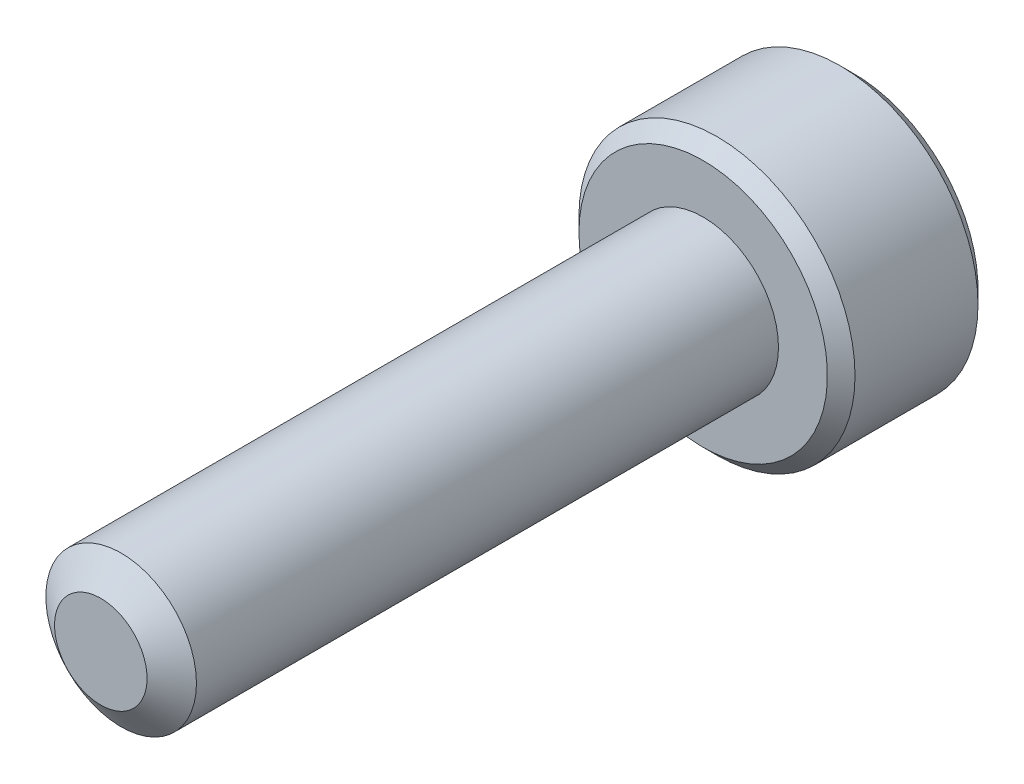
ISO-10303-21;
HEADER;
FILE_DESCRIPTION(('STEP AP214'),'2;1');
FILE_NAME('part.step','',(''),(''),'','','');
FILE_SCHEMA(('AUTOMOTIVE_DESIGN { 1 0 10303 214 1 1 1 1 }'));
ENDSEC;
DATA;
#1=APPLICATION_CONTEXT('core data for automotive mechanical design processes');
#2=APPLICATION_PROTOCOL_DEFINITION('international standard','automotive_design',2000,#1);
#3=PRODUCT_CONTEXT('',#1,'mechanical');
#4=PRODUCT('Part','Part','',(#3));
#5=PRODUCT_RELATED_PRODUCT_CATEGORY('part','',(#4));
#6=PRODUCT_DEFINITION_FORMATION('','',#4);
#7=PRODUCT_DEFINITION_CONTEXT('part definition',#1,'design');
#8=PRODUCT_DEFINITION('design','',#6,#7);
#9=PRODUCT_DEFINITION_SHAPE('','',#8);
#10=(LENGTH_UNIT() NAMED_UNIT(*) SI_UNIT(.MILLI.,.METRE.));
#11=(NAMED_UNIT(*) PLANE_ANGLE_UNIT() SI_UNIT($,.RADIAN.));
#12=(NAMED_UNIT(*) SI_UNIT($,.STERADIAN.) SOLID_ANGLE_UNIT());
#13=UNCERTAINTY_MEASURE_WITH_UNIT(LENGTH_MEASURE(1.E-05),#10,'distance_accuracy_value','');
#14=(GEOMETRIC_REPRESENTATION_CONTEXT(3) GLOBAL_UNCERTAINTY_ASSIGNED_CONTEXT((#13)) GLOBAL_UNIT_ASSIGNED_CONTEXT((#10,
#11,#12)) REPRESENTATION_CONTEXT('',''));
#15=CARTESIAN_POINT('',(0.,0.,0.));
#16=DIRECTION('',(0.,0.,1.));
#17=DIRECTION('',(1.,0.,0.));
#18=AXIS2_PLACEMENT_3D('',#15,#16,#17);
#19=CARTESIAN_POINT('',(0.,0.,-12.));
#20=DIRECTION('',(0.,0.,1.));
#21=DIRECTION('',(1.,0.,0.));
#22=AXIS2_PLACEMENT_3D('',#19,#20,#21);
#23=CYLINDRICAL_SURFACE('',#22,1.5);
#24=CARTESIAN_POINT('',(0.,0.,-12.));
#25=DIRECTION('',(0.,0.,-1.));
#26=DIRECTION('',(-1.,0.,0.));
#27=AXIS2_PLACEMENT_3D('',#24,#25,#26);
#28=CIRCLE('',#27,1.5);
#29=CARTESIAN_POINT('',(-1.5,0.,-12.));
#30=VERTEX_POINT('',#29);
#31=EDGE_CURVE('E154',#30,#30,#28,.F.);
#32=ORIENTED_EDGE('',*,*,#31,.T.);
#33=EDGE_LOOP('',(#32));
#34=FACE_BOUND('',#33,.T.);
#35=CARTESIAN_POINT('',(0.,0.,-0.40525178320938));
#36=DIRECTION('',(0.,0.,1.));
#37=DIRECTION('',(1.,0.,0.));
#38=AXIS2_PLACEMENT_3D('',#35,#36,#37);
#39=CIRCLE('',#38,1.5);
#40=CARTESIAN_POINT('',(1.5,0.,-0.40525178320938));
#41=VERTEX_POINT('',#40);
#42=EDGE_CURVE('E171',#41,#41,#39,.T.);
#43=ORIENTED_EDGE('',*,*,#42,.F.);
#44=EDGE_LOOP('',(#43));
#45=FACE_BOUND('',#44,.T.);
#46=ADVANCED_FACE('F39',(#34,#45),#23,.T.);
#47=CARTESIAN_POINT('',(0.,0.,0.));
#48=DIRECTION('',(0.,0.,-1.));
#49=DIRECTION('',(-1.,0.,0.));
#50=AXIS2_PLACEMENT_3D('',#47,#48,#49);
#51=CONICAL_SURFACE('',#50,0.921240473580834,0.959931088596884);
#52=ORIENTED_EDGE('',*,*,#42,.T.);
#53=EDGE_LOOP('',(#52));
#54=FACE_BOUND('',#53,.T.);
#55=CARTESIAN_POINT('',(0.,0.,0.));
#56=DIRECTION('',(0.,0.,1.));
#57=DIRECTION('',(1.,0.,0.));
#58=AXIS2_PLACEMENT_3D('',#55,#56,#57);
#59=CIRCLE('',#58,0.921240473580834);
#60=CARTESIAN_POINT('',(0.921240473580834,0.,0.));
#61=VERTEX_POINT('',#60);
#62=EDGE_CURVE('E167',#61,#61,#59,.T.);
#63=ORIENTED_EDGE('',*,*,#62,.F.);
#64=EDGE_LOOP('',(#63));
#65=FACE_BOUND('',#64,.T.);
#66=ADVANCED_FACE('F220',(#54,#65),#51,.T.);
#67=CARTESIAN_POINT('',(0.,0.,0.));
#68=DIRECTION('',(0.,0.,1.));
#69=DIRECTION('',(1.,0.,0.));
#70=AXIS2_PLACEMENT_3D('',#67,#68,#69);
#71=PLANE('',#70);
#72=ORIENTED_EDGE('',*,*,#62,.T.);
#73=EDGE_LOOP('',(#72));
#74=FACE_BOUND('',#73,.T.);
#75=ADVANCED_FACE('F226',(#74),#71,.T.);
#76=CARTESIAN_POINT('',(0.,0.,-15.));
#77=DIRECTION('',(0.,0.,1.));
#78=DIRECTION('',(1.,0.,0.));
#79=AXIS2_PLACEMENT_3D('',#76,#77,#78);
#80=CYLINDRICAL_SURFACE('',#79,2.75);
#81=CARTESIAN_POINT('',(0.,0.,-14.725));
#82=DIRECTION('',(0.,0.,-1.));
#83=DIRECTION('',(-1.,0.,0.));
#84=AXIS2_PLACEMENT_3D('',#81,#82,#83);
#85=CIRCLE('',#84,2.75);
#86=CARTESIAN_POINT('',(-2.75,0.,-14.725));
#87=VERTEX_POINT('',#86);
#88=EDGE_CURVE('E48',#87,#87,#85,.F.);
#89=ORIENTED_EDGE('',*,*,#88,.T.);
#90=EDGE_LOOP('',(#89));
#91=FACE_BOUND('',#90,.T.);
#92=CARTESIAN_POINT('',(0.,0.,-12.275));
#93=DIRECTION('',(0.,0.,-1.));
#94=DIRECTION('',(-1.,0.,0.));
#95=AXIS2_PLACEMENT_3D('',#92,#93,#94);
#96=CIRCLE('',#95,2.75);
#97=CARTESIAN_POINT('',(-2.75,0.,-12.275));
#98=VERTEX_POINT('',#97);
#99=EDGE_CURVE('E179',#98,#98,#96,.T.);
#100=ORIENTED_EDGE('',*,*,#99,.T.);
#101=EDGE_LOOP('',(#100));
#102=FACE_BOUND('',#101,.T.);
#103=ADVANCED_FACE('F186',(#91,#102),#80,.T.);
#104=CARTESIAN_POINT('',(0.,0.,-15.));
#105=DIRECTION('',(0.,0.,-1.));
#106=DIRECTION('',(-1.,0.,0.));
#107=AXIS2_PLACEMENT_3D('',#104,#105,#106);
#108=PLANE('',#107);
#109=CARTESIAN_POINT('',(0.,0.,-15.));
#110=DIRECTION('',(0.,0.,-1.));
#111=DIRECTION('',(-1.,0.,0.));
#112=AXIS2_PLACEMENT_3D('',#109,#110,#111);
#113=CIRCLE('',#112,2.475);
#114=CARTESIAN_POINT('',(-2.475,0.,-15.));
#115=VERTEX_POINT('',#114);
#116=EDGE_CURVE('E175',#115,#115,#113,.T.);
#117=ORIENTED_EDGE('',*,*,#116,.T.);
#118=EDGE_LOOP('',(#117));
#119=FACE_BOUND('',#118,.T.);
#120=DIRECTION('',(0.866025403784439,0.5,0.));
#121=VECTOR('',#120,1.);
#122=CARTESIAN_POINT('',(-1.25,0.721687836487032,-15.));
#123=LINE('',#122,#121);
#124=CARTESIAN_POINT('',(-1.25,0.721687836487032,-15.));
#125=VERTEX_POINT('',#124);
#126=CARTESIAN_POINT('',(0.,1.44337567297406,-15.));
#127=VERTEX_POINT('',#126);
#128=EDGE_CURVE('E55',#125,#127,#123,.T.);
#129=ORIENTED_EDGE('',*,*,#128,.F.);
#130=DIRECTION('',(0.,1.,0.));
#131=VECTOR('',#130,1.);
#132=CARTESIAN_POINT('',(-1.25,-0.721687836487032,-15.));
#133=LINE('',#132,#131);
#134=CARTESIAN_POINT('',(-1.25,-0.721687836487032,-15.));
#135=VERTEX_POINT('',#134);
#136=EDGE_CURVE('E148',#135,#125,#133,.T.);
#137=ORIENTED_EDGE('',*,*,#136,.F.);
#138=DIRECTION('',(-0.866025403784439,0.5,0.));
#139=VECTOR('',#138,1.);
#140=CARTESIAN_POINT('',(0.,-1.44337567297406,-15.));
#141=LINE('',#140,#139);
#142=CARTESIAN_POINT('',(0.,-1.44337567297406,-15.));
#143=VERTEX_POINT('',#142);
#144=EDGE_CURVE('E145',#143,#135,#141,.T.);
#145=ORIENTED_EDGE('',*,*,#144,.F.);
#146=DIRECTION('',(-0.866025403784439,-0.5,0.));
#147=VECTOR('',#146,1.);
#148=CARTESIAN_POINT('',(1.25,-0.721687836487033,-15.));
#149=LINE('',#148,#147);
#150=CARTESIAN_POINT('',(1.25,-0.721687836487033,-15.));
#151=VERTEX_POINT('',#150);
#152=EDGE_CURVE('E103',#151,#143,#149,.T.);
#153=ORIENTED_EDGE('',*,*,#152,.F.);
#154=DIRECTION('',(0.,-1.,0.));
#155=VECTOR('',#154,1.);
#156=CARTESIAN_POINT('',(1.25,0.721687836487032,-15.));
#157=LINE('',#156,#155);
#158=CARTESIAN_POINT('',(1.25,0.721687836487032,-15.));
#159=VERTEX_POINT('',#158);
#160=EDGE_CURVE('E139',#159,#151,#157,.T.);
#161=ORIENTED_EDGE('',*,*,#160,.F.);
#162=DIRECTION('',(0.866025403784439,-0.5,0.));
#163=VECTOR('',#162,1.);
#164=CARTESIAN_POINT('',(0.,1.44337567297406,-15.));
#165=LINE('',#164,#163);
#166=EDGE_CURVE('E135',#127,#159,#165,.T.);
#167=ORIENTED_EDGE('',*,*,#166,.F.);
#168=EDGE_LOOP('',(#129,#137,#145,#153,#161,#167));
#169=FACE_BOUND('',#168,.T.);
#170=ADVANCED_FACE('F194',(#119,#169),#108,.T.);
#171=CARTESIAN_POINT('',(0.,0.,-12.));
#172=DIRECTION('',(0.,0.,-1.));
#173=DIRECTION('',(-1.,0.,0.));
#174=AXIS2_PLACEMENT_3D('',#171,#172,#173);
#175=PLANE('',#174);
#176=CARTESIAN_POINT('',(0.,0.,-12.));
#177=DIRECTION('',(0.,0.,-1.));
#178=DIRECTION('',(-1.,0.,0.));
#179=AXIS2_PLACEMENT_3D('',#176,#177,#178);
#180=CIRCLE('',#179,2.475);
#181=CARTESIAN_POINT('',(-2.475,0.,-12.));
#182=VERTEX_POINT('',#181);
#183=EDGE_CURVE('E11',#182,#182,#180,.F.);
#184=ORIENTED_EDGE('',*,*,#183,.T.);
#185=EDGE_LOOP('',(#184));
#186=FACE_BOUND('',#185,.T.);
#187=ORIENTED_EDGE('',*,*,#31,.F.);
#188=EDGE_LOOP('',(#187));
#189=FACE_BOUND('',#188,.T.);
#190=ADVANCED_FACE('F197',(#186,#189),#175,.F.);
#191=CARTESIAN_POINT('',(-1.25,0.721687836487032,-13.125));
#192=DIRECTION('',(-0.5,0.866025403784439,0.));
#193=DIRECTION('',(-0.866025403784439,-0.5,0.));
#194=AXIS2_PLACEMENT_3D('',#191,#192,#193);
#195=PLANE('',#194);
#196=ORIENTED_EDGE('',*,*,#128,.T.);
#197=DIRECTION('',(0.,0.,-1.));
#198=VECTOR('',#197,1.);
#199=CARTESIAN_POINT('',(0.,1.44337567297406,-13.125));
#200=LINE('',#199,#198);
#201=CARTESIAN_POINT('',(0.,1.44337567297406,-13.125));
#202=VERTEX_POINT('',#201);
#203=EDGE_CURVE('E85',#202,#127,#200,.T.);
#204=ORIENTED_EDGE('',*,*,#203,.F.);
#205=DIRECTION('',(0.866025403784439,0.5,0.));
#206=VECTOR('',#205,1.);
#207=CARTESIAN_POINT('',(-1.25,0.721687836487032,-13.125));
#208=LINE('',#207,#206);
#209=CARTESIAN_POINT('',(-1.25,0.721687836487032,-13.125));
#210=VERTEX_POINT('',#209);
#211=EDGE_CURVE('E151',#210,#202,#208,.T.);
#212=ORIENTED_EDGE('',*,*,#211,.F.);
#213=DIRECTION('',(0.,0.,-1.));
#214=VECTOR('',#213,1.);
#215=CARTESIAN_POINT('',(-1.25,0.721687836487032,-13.125));
#216=LINE('',#215,#214);
#217=EDGE_CURVE('E63',#210,#125,#216,.T.);
#218=ORIENTED_EDGE('',*,*,#217,.T.);
#219=EDGE_LOOP('',(#196,#204,#212,#218));
#220=FACE_BOUND('',#219,.T.);
#221=ADVANCED_FACE('F207',(#220),#195,.F.);
#222=CARTESIAN_POINT('',(-1.25,-0.721687836487032,-13.125));
#223=DIRECTION('',(-1.,0.,0.));
#224=DIRECTION('',(0.,-1.,0.));
#225=AXIS2_PLACEMENT_3D('',#222,#223,#224);
#226=PLANE('',#225);
#227=ORIENTED_EDGE('',*,*,#136,.T.);
#228=ORIENTED_EDGE('',*,*,#217,.F.);
#229=DIRECTION('',(0.,1.,0.));
#230=VECTOR('',#229,1.);
#231=CARTESIAN_POINT('',(-1.25,-0.721687836487032,-13.125));
#232=LINE('',#231,#230);
#233=CARTESIAN_POINT('',(-1.25,-0.721687836487032,-13.125));
#234=VERTEX_POINT('',#233);
#235=EDGE_CURVE('E117',#234,#210,#232,.T.);
#236=ORIENTED_EDGE('',*,*,#235,.F.);
#237=DIRECTION('',(0.,0.,-1.));
#238=VECTOR('',#237,1.);
#239=CARTESIAN_POINT('',(-1.25,-0.721687836487032,-13.125));
#240=LINE('',#239,#238);
#241=EDGE_CURVE('E108',#234,#135,#240,.T.);
#242=ORIENTED_EDGE('',*,*,#241,.T.);
#243=EDGE_LOOP('',(#227,#228,#236,#242));
#244=FACE_BOUND('',#243,.T.);
#245=ADVANCED_FACE('F209',(#244),#226,.F.);
#246=CARTESIAN_POINT('',(0.,-1.44337567297406,-13.125));
#247=DIRECTION('',(-0.5,-0.866025403784439,0.));
#248=DIRECTION('',(0.866025403784439,-0.5,0.));
#249=AXIS2_PLACEMENT_3D('',#246,#247,#248);
#250=PLANE('',#249);
#251=ORIENTED_EDGE('',*,*,#144,.T.);
#252=ORIENTED_EDGE('',*,*,#241,.F.);
#253=DIRECTION('',(-0.866025403784439,0.5,0.));
#254=VECTOR('',#253,1.);
#255=CARTESIAN_POINT('',(0.,-1.44337567297406,-13.125));
#256=LINE('',#255,#254);
#257=CARTESIAN_POINT('',(0.,-1.44337567297406,-13.125));
#258=VERTEX_POINT('',#257);
#259=EDGE_CURVE('E112',#258,#234,#256,.T.);
#260=ORIENTED_EDGE('',*,*,#259,.F.);
#261=DIRECTION('',(0.,0.,-1.));
#262=VECTOR('',#261,1.);
#263=CARTESIAN_POINT('',(0.,-1.44337567297406,-13.125));
#264=LINE('',#263,#262);
#265=EDGE_CURVE('E96',#258,#143,#264,.T.);
#266=ORIENTED_EDGE('',*,*,#265,.T.);
#267=EDGE_LOOP('',(#251,#252,#260,#266));
#268=FACE_BOUND('',#267,.T.);
#269=ADVANCED_FACE('F113',(#268),#250,.F.);
#270=CARTESIAN_POINT('',(1.25,-0.721687836487033,-13.125));
#271=DIRECTION('',(0.5,-0.866025403784439,0.));
#272=DIRECTION('',(0.866025403784439,0.5,0.));
#273=AXIS2_PLACEMENT_3D('',#270,#271,#272);
#274=PLANE('',#273);
#275=ORIENTED_EDGE('',*,*,#152,.T.);
#276=ORIENTED_EDGE('',*,*,#265,.F.);
#277=DIRECTION('',(-0.866025403784439,-0.5,0.));
#278=VECTOR('',#277,1.);
#279=CARTESIAN_POINT('',(1.25,-0.721687836487033,-13.125));
#280=LINE('',#279,#278);
#281=CARTESIAN_POINT('',(1.25,-0.721687836487033,-13.125));
#282=VERTEX_POINT('',#281);
#283=EDGE_CURVE('E100',#282,#258,#280,.T.);
#284=ORIENTED_EDGE('',*,*,#283,.F.);
#285=DIRECTION('',(0.,0.,-1.));
#286=VECTOR('',#285,1.);
#287=CARTESIAN_POINT('',(1.25,-0.721687836487033,-13.125));
#288=LINE('',#287,#286);
#289=EDGE_CURVE('E109',#282,#151,#288,.T.);
#290=ORIENTED_EDGE('',*,*,#289,.T.);
#291=EDGE_LOOP('',(#275,#276,#284,#290));
#292=FACE_BOUND('',#291,.T.);
#293=ADVANCED_FACE('F98',(#292),#274,.F.);
#294=CARTESIAN_POINT('',(1.25,0.721687836487032,-13.125));
#295=DIRECTION('',(1.,0.,0.));
#296=DIRECTION('',(0.,0.,-1.));
#297=AXIS2_PLACEMENT_3D('',#294,#295,#296);
#298=PLANE('',#297);
#299=ORIENTED_EDGE('',*,*,#160,.T.);
#300=ORIENTED_EDGE('',*,*,#289,.F.);
#301=DIRECTION('',(0.,-1.,0.));
#302=VECTOR('',#301,1.);
#303=CARTESIAN_POINT('',(1.25,0.721687836487032,-13.125));
#304=LINE('',#303,#302);
#305=CARTESIAN_POINT('',(1.25,0.721687836487032,-13.125));
#306=VERTEX_POINT('',#305);
#307=EDGE_CURVE('E123',#306,#282,#304,.T.);
#308=ORIENTED_EDGE('',*,*,#307,.F.);
#309=DIRECTION('',(0.,0.,-1.));
#310=VECTOR('',#309,1.);
#311=CARTESIAN_POINT('',(1.25,0.721687836487032,-13.125));
#312=LINE('',#311,#310);
#313=EDGE_CURVE('E159',#306,#159,#312,.T.);
#314=ORIENTED_EDGE('',*,*,#313,.T.);
#315=EDGE_LOOP('',(#299,#300,#308,#314));
#316=FACE_BOUND('',#315,.T.);
#317=ADVANCED_FACE('F281',(#316),#298,.F.);
#318=CARTESIAN_POINT('',(0.,1.44337567297406,-13.125));
#319=DIRECTION('',(0.5,0.866025403784439,0.));
#320=DIRECTION('',(-0.866025403784439,0.5,0.));
#321=AXIS2_PLACEMENT_3D('',#318,#319,#320);
#322=PLANE('',#321);
#323=ORIENTED_EDGE('',*,*,#166,.T.);
#324=ORIENTED_EDGE('',*,*,#313,.F.);
#325=DIRECTION('',(0.866025403784439,-0.5,0.));
#326=VECTOR('',#325,1.);
#327=CARTESIAN_POINT('',(0.,1.44337567297406,-13.125));
#328=LINE('',#327,#326);
#329=EDGE_CURVE('E127',#202,#306,#328,.T.);
#330=ORIENTED_EDGE('',*,*,#329,.F.);
#331=ORIENTED_EDGE('',*,*,#203,.T.);
#332=EDGE_LOOP('',(#323,#324,#330,#331));
#333=FACE_BOUND('',#332,.T.);
#334=ADVANCED_FACE('F203',(#333),#322,.F.);
#335=CARTESIAN_POINT('',(1.25,2.1650635094611,-13.125));
#336=DIRECTION('',(0.,0.,-1.));
#337=DIRECTION('',(-1.,0.,0.));
#338=AXIS2_PLACEMENT_3D('',#335,#336,#337);
#339=PLANE('',#338);
#340=ORIENTED_EDGE('',*,*,#211,.T.);
#341=ORIENTED_EDGE('',*,*,#329,.T.);
#342=ORIENTED_EDGE('',*,*,#307,.T.);
#343=ORIENTED_EDGE('',*,*,#283,.T.);
#344=ORIENTED_EDGE('',*,*,#259,.T.);
#345=ORIENTED_EDGE('',*,*,#235,.T.);
#346=EDGE_LOOP('',(#340,#341,#342,#343,#344,#345));
#347=FACE_BOUND('',#346,.T.);
#348=ADVANCED_FACE('F120',(#347),#339,.T.);
#349=CARTESIAN_POINT('',(0.,0.,-15.));
#350=DIRECTION('',(0.,0.,1.));
#351=DIRECTION('',(1.,0.,0.));
#352=AXIS2_PLACEMENT_3D('',#349,#350,#351);
#353=CONICAL_SURFACE('',#352,2.475,0.785398163397447);
#354=ORIENTED_EDGE('',*,*,#88,.F.);
#355=EDGE_LOOP('',(#354));
#356=FACE_BOUND('',#355,.T.);
#357=ORIENTED_EDGE('',*,*,#116,.F.);
#358=EDGE_LOOP('',(#357));
#359=FACE_BOUND('',#358,.T.);
#360=ADVANCED_FACE('F189',(#356,#359),#353,.T.);
#361=CARTESIAN_POINT('',(0.,0.,-12.275));
#362=DIRECTION('',(0.,0.,-1.));
#363=DIRECTION('',(-1.,0.,0.));
#364=AXIS2_PLACEMENT_3D('',#361,#362,#363);
#365=CONICAL_SURFACE('',#364,2.75,0.78539816339745);
#366=ORIENTED_EDGE('',*,*,#183,.F.);
#367=EDGE_LOOP('',(#366));
#368=FACE_BOUND('',#367,.T.);
#369=ORIENTED_EDGE('',*,*,#99,.F.);
#370=EDGE_LOOP('',(#369));
#371=FACE_BOUND('',#370,.T.);
#372=ADVANCED_FACE('F41',(#368,#371),#365,.T.);
#373=CLOSED_SHELL('',(#46,#66,#75,#103,#170,#190,#221,#245,#269,#293,#317,#334,#348,#360,#372));
#374=MANIFOLD_SOLID_BREP('B2',#373);
#375=ADVANCED_BREP_SHAPE_REPRESENTATION('',(#18,#374),#14);
#376=SHAPE_DEFINITION_REPRESENTATION(#9,#375);
ENDSEC;
END-ISO-10303-21;
